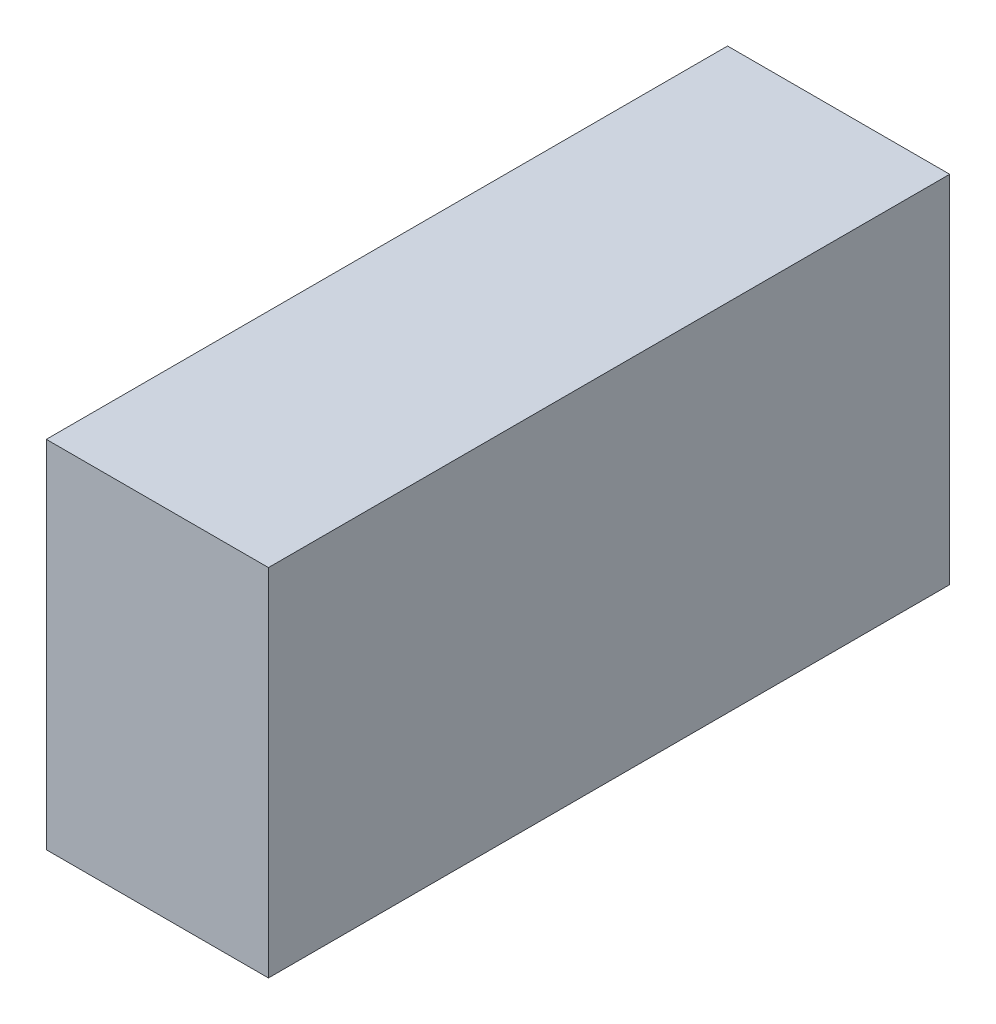
ISO-10303-21;
HEADER;
FILE_DESCRIPTION(('STEP AP214'),'2;1');
FILE_NAME('part.step','',(''),(''),'','','');
FILE_SCHEMA(('AUTOMOTIVE_DESIGN { 1 0 10303 214 1 1 1 1 }'));
ENDSEC;
DATA;
#1=APPLICATION_CONTEXT('core data for automotive mechanical design processes');
#2=APPLICATION_PROTOCOL_DEFINITION('international standard','automotive_design',2000,#1);
#3=PRODUCT_CONTEXT('',#1,'mechanical');
#4=PRODUCT('Part','Part','',(#3));
#5=PRODUCT_RELATED_PRODUCT_CATEGORY('part','',(#4));
#6=PRODUCT_DEFINITION_FORMATION('','',#4);
#7=PRODUCT_DEFINITION_CONTEXT('part definition',#1,'design');
#8=PRODUCT_DEFINITION('design','',#6,#7);
#9=PRODUCT_DEFINITION_SHAPE('','',#8);
#10=(LENGTH_UNIT() NAMED_UNIT(*) SI_UNIT(.MILLI.,.METRE.));
#11=(NAMED_UNIT(*) PLANE_ANGLE_UNIT() SI_UNIT($,.RADIAN.));
#12=(NAMED_UNIT(*) SI_UNIT($,.STERADIAN.) SOLID_ANGLE_UNIT());
#13=UNCERTAINTY_MEASURE_WITH_UNIT(LENGTH_MEASURE(1.E-05),#10,'distance_accuracy_value','');
#14=(GEOMETRIC_REPRESENTATION_CONTEXT(3) GLOBAL_UNCERTAINTY_ASSIGNED_CONTEXT((#13)) GLOBAL_UNIT_ASSIGNED_CONTEXT((#10,
#11,#12)) REPRESENTATION_CONTEXT('',''));
#15=CARTESIAN_POINT('',(0.,0.,0.));
#16=DIRECTION('',(0.,0.,1.));
#17=DIRECTION('',(1.,0.,0.));
#18=AXIS2_PLACEMENT_3D('',#15,#16,#17);
#19=CARTESIAN_POINT('',(-22.5,72.,69.));
#20=DIRECTION('',(1.,0.,0.));
#21=DIRECTION('',(0.,0.,-1.));
#22=AXIS2_PLACEMENT_3D('',#19,#20,#21);
#23=PLANE('',#22);
#24=DIRECTION('',(0.,0.,1.));
#25=VECTOR('',#24,1.);
#26=CARTESIAN_POINT('',(-22.5,0.,69.));
#27=LINE('',#26,#25);
#28=CARTESIAN_POINT('',(-22.5,0.,-69.));
#29=VERTEX_POINT('',#28);
#30=CARTESIAN_POINT('',(-22.5,0.,69.));
#31=VERTEX_POINT('',#30);
#32=EDGE_CURVE('E97',#29,#31,#27,.T.);
#33=ORIENTED_EDGE('',*,*,#32,.T.);
#34=DIRECTION('',(0.,-1.,0.));
#35=VECTOR('',#34,1.);
#36=CARTESIAN_POINT('',(-22.5,72.,69.));
#37=LINE('',#36,#35);
#38=CARTESIAN_POINT('',(-22.5,72.,69.));
#39=VERTEX_POINT('',#38);
#40=EDGE_CURVE('E11',#39,#31,#37,.T.);
#41=ORIENTED_EDGE('',*,*,#40,.F.);
#42=DIRECTION('',(0.,0.,1.));
#43=VECTOR('',#42,1.);
#44=CARTESIAN_POINT('',(-22.5,72.,69.));
#45=LINE('',#44,#43);
#46=CARTESIAN_POINT('',(-22.5,72.,-69.));
#47=VERTEX_POINT('',#46);
#48=EDGE_CURVE('E85',#47,#39,#45,.T.);
#49=ORIENTED_EDGE('',*,*,#48,.F.);
#50=DIRECTION('',(0.,-1.,0.));
#51=VECTOR('',#50,1.);
#52=CARTESIAN_POINT('',(-22.5,72.,-69.));
#53=LINE('',#52,#51);
#54=EDGE_CURVE('E93',#47,#29,#53,.T.);
#55=ORIENTED_EDGE('',*,*,#54,.T.);
#56=EDGE_LOOP('',(#33,#41,#49,#55));
#57=FACE_BOUND('',#56,.T.);
#58=ADVANCED_FACE('F34',(#57),#23,.F.);
#59=CARTESIAN_POINT('',(-22.5,72.,69.));
#60=DIRECTION('',(0.,0.,-1.));
#61=DIRECTION('',(-1.,0.,0.));
#62=AXIS2_PLACEMENT_3D('',#59,#60,#61);
#63=PLANE('',#62);
#64=DIRECTION('',(1.,0.,0.));
#65=VECTOR('',#64,1.);
#66=CARTESIAN_POINT('',(-22.5,0.,69.));
#67=LINE('',#66,#65);
#68=CARTESIAN_POINT('',(22.5,0.,69.));
#69=VERTEX_POINT('',#68);
#70=EDGE_CURVE('E89',#31,#69,#67,.T.);
#71=ORIENTED_EDGE('',*,*,#70,.T.);
#72=DIRECTION('',(0.,-1.,0.));
#73=VECTOR('',#72,1.);
#74=CARTESIAN_POINT('',(22.5,72.,69.));
#75=LINE('',#74,#73);
#76=CARTESIAN_POINT('',(22.5,72.,69.));
#77=VERTEX_POINT('',#76);
#78=EDGE_CURVE('E42',#77,#69,#75,.T.);
#79=ORIENTED_EDGE('',*,*,#78,.F.);
#80=DIRECTION('',(1.,0.,0.));
#81=VECTOR('',#80,1.);
#82=CARTESIAN_POINT('',(-22.5,72.,69.));
#83=LINE('',#82,#81);
#84=EDGE_CURVE('E80',#39,#77,#83,.T.);
#85=ORIENTED_EDGE('',*,*,#84,.F.);
#86=ORIENTED_EDGE('',*,*,#40,.T.);
#87=EDGE_LOOP('',(#71,#79,#85,#86));
#88=FACE_BOUND('',#87,.T.);
#89=ADVANCED_FACE('F88',(#88),#63,.F.);
#90=CARTESIAN_POINT('',(22.5,72.,69.));
#91=DIRECTION('',(-1.,0.,0.));
#92=DIRECTION('',(0.,0.,1.));
#93=AXIS2_PLACEMENT_3D('',#90,#91,#92);
#94=PLANE('',#93);
#95=DIRECTION('',(0.,0.,-1.));
#96=VECTOR('',#95,1.);
#97=CARTESIAN_POINT('',(22.5,0.,69.));
#98=LINE('',#97,#96);
#99=CARTESIAN_POINT('',(22.5,0.,-69.));
#100=VERTEX_POINT('',#99);
#101=EDGE_CURVE('E67',#69,#100,#98,.T.);
#102=ORIENTED_EDGE('',*,*,#101,.T.);
#103=DIRECTION('',(0.,-1.,0.));
#104=VECTOR('',#103,1.);
#105=CARTESIAN_POINT('',(22.5,72.,-69.));
#106=LINE('',#105,#104);
#107=CARTESIAN_POINT('',(22.5,72.,-69.));
#108=VERTEX_POINT('',#107);
#109=EDGE_CURVE('E90',#108,#100,#106,.T.);
#110=ORIENTED_EDGE('',*,*,#109,.F.);
#111=DIRECTION('',(0.,0.,-1.));
#112=VECTOR('',#111,1.);
#113=CARTESIAN_POINT('',(22.5,72.,69.));
#114=LINE('',#113,#112);
#115=EDGE_CURVE('E83',#77,#108,#114,.T.);
#116=ORIENTED_EDGE('',*,*,#115,.F.);
#117=ORIENTED_EDGE('',*,*,#78,.T.);
#118=EDGE_LOOP('',(#102,#110,#116,#117));
#119=FACE_BOUND('',#118,.T.);
#120=ADVANCED_FACE('F91',(#119),#94,.F.);
#121=CARTESIAN_POINT('',(-22.5,72.,-69.));
#122=DIRECTION('',(0.,0.,1.));
#123=DIRECTION('',(1.,0.,0.));
#124=AXIS2_PLACEMENT_3D('',#121,#122,#123);
#125=PLANE('',#124);
#126=DIRECTION('',(-1.,0.,0.));
#127=VECTOR('',#126,1.);
#128=CARTESIAN_POINT('',(-22.5,0.,-69.));
#129=LINE('',#128,#127);
#130=EDGE_CURVE('E73',#100,#29,#129,.T.);
#131=ORIENTED_EDGE('',*,*,#130,.T.);
#132=ORIENTED_EDGE('',*,*,#54,.F.);
#133=DIRECTION('',(-1.,0.,0.));
#134=VECTOR('',#133,1.);
#135=CARTESIAN_POINT('',(-22.5,72.,-69.));
#136=LINE('',#135,#134);
#137=EDGE_CURVE('E50',#108,#47,#136,.T.);
#138=ORIENTED_EDGE('',*,*,#137,.F.);
#139=ORIENTED_EDGE('',*,*,#109,.T.);
#140=EDGE_LOOP('',(#131,#132,#138,#139));
#141=FACE_BOUND('',#140,.T.);
#142=ADVANCED_FACE('F104',(#141),#125,.F.);
#143=CARTESIAN_POINT('',(0.,72.,0.));
#144=DIRECTION('',(0.,-1.,0.));
#145=DIRECTION('',(0.,0.,-1.));
#146=AXIS2_PLACEMENT_3D('',#143,#144,#145);
#147=PLANE('',#146);
#148=ORIENTED_EDGE('',*,*,#48,.T.);
#149=ORIENTED_EDGE('',*,*,#84,.T.);
#150=ORIENTED_EDGE('',*,*,#115,.T.);
#151=ORIENTED_EDGE('',*,*,#137,.T.);
#152=EDGE_LOOP('',(#148,#149,#150,#151));
#153=FACE_BOUND('',#152,.T.);
#154=ADVANCED_FACE('F81',(#153),#147,.F.);
#155=CARTESIAN_POINT('',(0.,0.,0.));
#156=DIRECTION('',(0.,-1.,0.));
#157=DIRECTION('',(0.,0.,-1.));
#158=AXIS2_PLACEMENT_3D('',#155,#156,#157);
#159=PLANE('',#158);
#160=ORIENTED_EDGE('',*,*,#32,.F.);
#161=ORIENTED_EDGE('',*,*,#130,.F.);
#162=ORIENTED_EDGE('',*,*,#101,.F.);
#163=ORIENTED_EDGE('',*,*,#70,.F.);
#164=EDGE_LOOP('',(#160,#161,#162,#163));
#165=FACE_BOUND('',#164,.T.);
#166=ADVANCED_FACE('F107',(#165),#159,.T.);
#167=CLOSED_SHELL('',(#58,#89,#120,#142,#154,#166));
#168=MANIFOLD_SOLID_BREP('B2',#167);
#169=ADVANCED_BREP_SHAPE_REPRESENTATION('',(#18,#168),#14);
#170=SHAPE_DEFINITION_REPRESENTATION(#9,#169);
ENDSEC;
END-ISO-10303-21;
